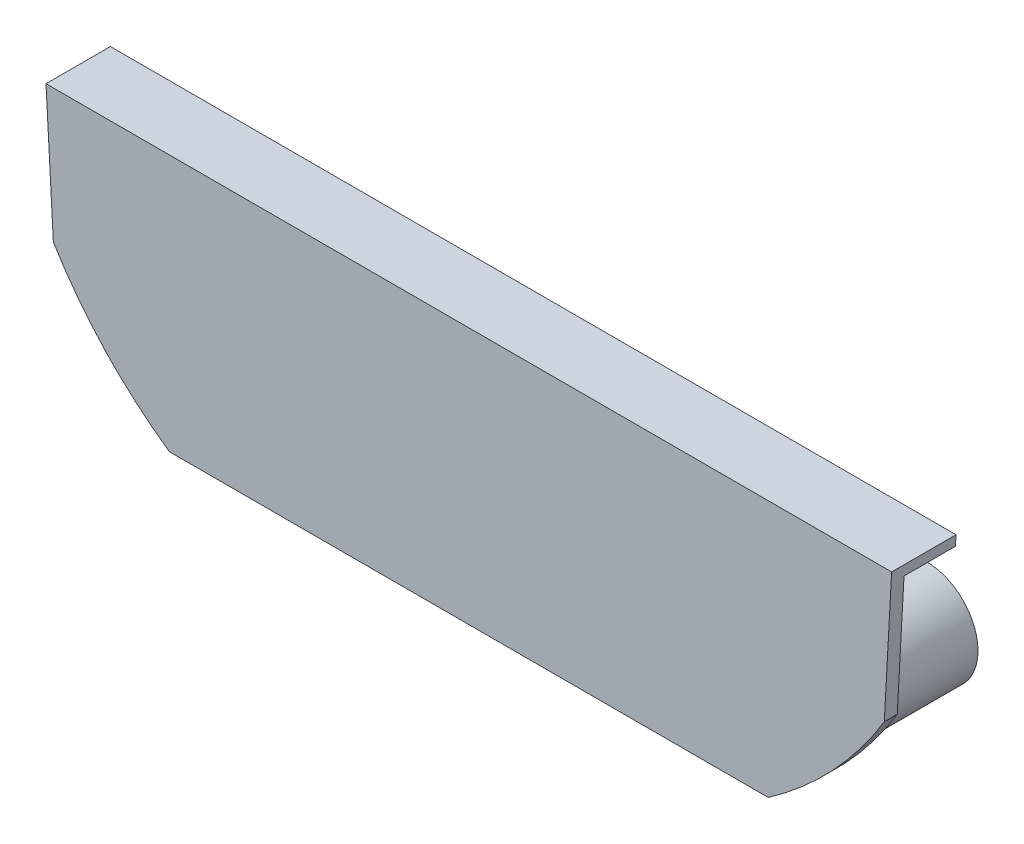
ISO-10303-21;
HEADER;
FILE_DESCRIPTION(('STEP AP214'),'2;1');
FILE_NAME('part.step','',(''),(''),'','','');
FILE_SCHEMA(('AUTOMOTIVE_DESIGN { 1 0 10303 214 1 1 1 1 }'));
ENDSEC;
DATA;
#1=APPLICATION_CONTEXT('core data for automotive mechanical design processes');
#2=APPLICATION_PROTOCOL_DEFINITION('international standard','automotive_design',2000,#1);
#3=PRODUCT_CONTEXT('',#1,'mechanical');
#4=PRODUCT('Part','Part','',(#3));
#5=PRODUCT_RELATED_PRODUCT_CATEGORY('part','',(#4));
#6=PRODUCT_DEFINITION_FORMATION('','',#4);
#7=PRODUCT_DEFINITION_CONTEXT('part definition',#1,'design');
#8=PRODUCT_DEFINITION('design','',#6,#7);
#9=PRODUCT_DEFINITION_SHAPE('','',#8);
#10=(LENGTH_UNIT() NAMED_UNIT(*) SI_UNIT(.MILLI.,.METRE.));
#11=(NAMED_UNIT(*) PLANE_ANGLE_UNIT() SI_UNIT($,.RADIAN.));
#12=(NAMED_UNIT(*) SI_UNIT($,.STERADIAN.) SOLID_ANGLE_UNIT());
#13=UNCERTAINTY_MEASURE_WITH_UNIT(LENGTH_MEASURE(1.E-05),#10,'distance_accuracy_value','');
#14=(GEOMETRIC_REPRESENTATION_CONTEXT(3) GLOBAL_UNCERTAINTY_ASSIGNED_CONTEXT((#13)) GLOBAL_UNIT_ASSIGNED_CONTEXT((#10,
#11,#12)) REPRESENTATION_CONTEXT('',''));
#15=CARTESIAN_POINT('',(0.,0.,0.));
#16=DIRECTION('',(0.,0.,1.));
#17=DIRECTION('',(1.,0.,0.));
#18=AXIS2_PLACEMENT_3D('',#15,#16,#17);
#19=CARTESIAN_POINT('',(22.8926152800397,32.8013439608821,0.));
#20=DIRECTION('',(0.,0.,1.));
#21=DIRECTION('',(1.,0.,0.));
#22=AXIS2_PLACEMENT_3D('',#19,#20,#21);
#23=PLANE('',#22);
#24=CARTESIAN_POINT('',(-3.61,11.3,0.));
#25=DIRECTION('',(0.,0.,1.));
#26=DIRECTION('',(1.,0.,0.));
#27=AXIS2_PLACEMENT_3D('',#24,#25,#26);
#28=CIRCLE('',#27,5.);
#29=CARTESIAN_POINT('',(1.39000000000001,11.3,0.));
#30=VERTEX_POINT('',#29);
#31=EDGE_CURVE('E131',#30,#30,#28,.T.);
#32=ORIENTED_EDGE('',*,*,#31,.T.);
#33=EDGE_LOOP('',(#32));
#34=FACE_BOUND('',#33,.T.);
#35=CARTESIAN_POINT('',(62.39,11.3,0.));
#36=DIRECTION('',(0.,0.,1.));
#37=DIRECTION('',(1.,0.,0.));
#38=AXIS2_PLACEMENT_3D('',#35,#36,#37);
#39=CIRCLE('',#38,4.99999999999999);
#40=CARTESIAN_POINT('',(67.39,11.3,0.));
#41=VERTEX_POINT('',#40);
#42=EDGE_CURVE('E38',#41,#41,#39,.T.);
#43=ORIENTED_EDGE('',*,*,#42,.T.);
#44=EDGE_LOOP('',(#43));
#45=FACE_BOUND('',#44,.T.);
#46=DIRECTION('',(-1.,0.,0.));
#47=VECTOR('',#46,1.);
#48=CARTESIAN_POINT('',(-11.9449307866786,24.,0.));
#49=LINE('',#48,#47);
#50=CARTESIAN_POINT('',(70.1949307866785,24.,0.));
#51=VERTEX_POINT('',#50);
#52=CARTESIAN_POINT('',(-11.9449307866786,24.,0.));
#53=VERTEX_POINT('',#52);
#54=EDGE_CURVE('E164',#51,#53,#49,.T.);
#55=ORIENTED_EDGE('',*,*,#54,.F.);
#56=DIRECTION('',(0.0549859008140824,0.99848713096948,0.));
#57=VECTOR('',#56,1.);
#58=CARTESIAN_POINT('',(70.25,25.,0.));
#59=LINE('',#58,#57);
#60=CARTESIAN_POINT('',(69.5351832894169,12.0196672973968,0.));
#61=VERTEX_POINT('',#60);
#62=EDGE_CURVE('E134',#61,#51,#59,.T.);
#63=ORIENTED_EDGE('',*,*,#62,.F.);
#64=CARTESIAN_POINT('',(35.3573847199603,32.8013439608821,0.));
#65=DIRECTION('',(0.,0.,1.));
#66=DIRECTION('',(-1.,0.,0.));
#67=AXIS2_PLACEMENT_3D('',#64,#65,#66);
#68=CIRCLE('',#67,40.);
#69=CARTESIAN_POINT('',(58.25,0.,0.));
#70=VERTEX_POINT('',#69);
#71=EDGE_CURVE('E71',#70,#61,#68,.T.);
#72=ORIENTED_EDGE('',*,*,#71,.F.);
#73=DIRECTION('',(1.,0.,0.));
#74=VECTOR('',#73,1.);
#75=CARTESIAN_POINT('',(0.,0.,0.));
#76=LINE('',#75,#74);
#77=CARTESIAN_POINT('',(0.,0.,0.));
#78=VERTEX_POINT('',#77);
#79=EDGE_CURVE('E130',#78,#70,#76,.T.);
#80=ORIENTED_EDGE('',*,*,#79,.F.);
#81=CARTESIAN_POINT('',(22.8926152800397,32.8013439608821,0.));
#82=DIRECTION('',(0.,0.,1.));
#83=DIRECTION('',(1.,0.,0.));
#84=AXIS2_PLACEMENT_3D('',#81,#82,#83);
#85=CIRCLE('',#84,40.);
#86=CARTESIAN_POINT('',(-11.2851832894169,12.0196672973968,0.));
#87=VERTEX_POINT('',#86);
#88=EDGE_CURVE('E127',#87,#78,#85,.T.);
#89=ORIENTED_EDGE('',*,*,#88,.F.);
#90=DIRECTION('',(0.0549859008140824,-0.99848713096948,0.));
#91=VECTOR('',#90,1.);
#92=CARTESIAN_POINT('',(-12.,25.,0.));
#93=LINE('',#92,#91);
#94=EDGE_CURVE('E78',#53,#87,#93,.T.);
#95=ORIENTED_EDGE('',*,*,#94,.F.);
#96=EDGE_LOOP('',(#55,#63,#72,#80,#89,#95));
#97=FACE_BOUND('',#96,.T.);
#98=ADVANCED_FACE('F34',(#34,#45,#97),#23,.F.);
#99=CARTESIAN_POINT('',(22.8926152800397,32.8013439608821,1.26));
#100=DIRECTION('',(0.,0.,-1.));
#101=DIRECTION('',(-1.,0.,0.));
#102=AXIS2_PLACEMENT_3D('',#99,#100,#101);
#103=CYLINDRICAL_SURFACE('',#102,40.);
#104=ORIENTED_EDGE('',*,*,#88,.T.);
#105=DIRECTION('',(0.,0.,-1.));
#106=VECTOR('',#105,1.);
#107=CARTESIAN_POINT('',(0.,0.,1.26));
#108=LINE('',#107,#106);
#109=CARTESIAN_POINT('',(0.,0.,1.26));
#110=VERTEX_POINT('',#109);
#111=EDGE_CURVE('E11',#110,#78,#108,.T.);
#112=ORIENTED_EDGE('',*,*,#111,.F.);
#113=CARTESIAN_POINT('',(22.8926152800397,32.8013439608821,1.26));
#114=DIRECTION('',(0.,0.,1.));
#115=DIRECTION('',(1.,0.,0.));
#116=AXIS2_PLACEMENT_3D('',#113,#114,#115);
#117=CIRCLE('',#116,40.);
#118=CARTESIAN_POINT('',(-11.2851832894169,12.0196672973968,1.26));
#119=VERTEX_POINT('',#118);
#120=EDGE_CURVE('E137',#119,#110,#117,.T.);
#121=ORIENTED_EDGE('',*,*,#120,.F.);
#122=DIRECTION('',(0.,0.,-1.));
#123=VECTOR('',#122,1.);
#124=CARTESIAN_POINT('',(-11.2851832894169,12.0196672973968,1.26));
#125=LINE('',#124,#123);
#126=EDGE_CURVE('E123',#119,#87,#125,.T.);
#127=ORIENTED_EDGE('',*,*,#126,.T.);
#128=EDGE_LOOP('',(#104,#112,#121,#127));
#129=FACE_BOUND('',#128,.T.);
#130=ADVANCED_FACE('F36',(#129),#103,.T.);
#131=CARTESIAN_POINT('',(0.,0.,1.26));
#132=DIRECTION('',(0.,1.,0.));
#133=DIRECTION('',(-1.,0.,0.));
#134=AXIS2_PLACEMENT_3D('',#131,#132,#133);
#135=PLANE('',#134);
#136=ORIENTED_EDGE('',*,*,#79,.T.);
#137=DIRECTION('',(0.,0.,-1.));
#138=VECTOR('',#137,1.);
#139=CARTESIAN_POINT('',(58.25,0.,1.26));
#140=LINE('',#139,#138);
#141=CARTESIAN_POINT('',(58.25,0.,1.26));
#142=VERTEX_POINT('',#141);
#143=EDGE_CURVE('E44',#142,#70,#140,.T.);
#144=ORIENTED_EDGE('',*,*,#143,.F.);
#145=DIRECTION('',(1.,0.,0.));
#146=VECTOR('',#145,1.);
#147=CARTESIAN_POINT('',(0.,0.,1.26));
#148=LINE('',#147,#146);
#149=EDGE_CURVE('E86',#110,#142,#148,.T.);
#150=ORIENTED_EDGE('',*,*,#149,.F.);
#151=ORIENTED_EDGE('',*,*,#111,.T.);
#152=EDGE_LOOP('',(#136,#144,#150,#151));
#153=FACE_BOUND('',#152,.T.);
#154=ADVANCED_FACE('F157',(#153),#135,.F.);
#155=CARTESIAN_POINT('',(35.3573847199603,32.8013439608821,1.26));
#156=DIRECTION('',(0.,0.,-1.));
#157=DIRECTION('',(-1.,0.,0.));
#158=AXIS2_PLACEMENT_3D('',#155,#156,#157);
#159=CYLINDRICAL_SURFACE('',#158,40.);
#160=ORIENTED_EDGE('',*,*,#71,.T.);
#161=DIRECTION('',(0.,0.,-1.));
#162=VECTOR('',#161,1.);
#163=CARTESIAN_POINT('',(69.5351832894169,12.0196672973968,1.26));
#164=LINE('',#163,#162);
#165=CARTESIAN_POINT('',(69.5351832894169,12.0196672973968,1.26));
#166=VERTEX_POINT('',#165);
#167=EDGE_CURVE('E117',#166,#61,#164,.T.);
#168=ORIENTED_EDGE('',*,*,#167,.F.);
#169=CARTESIAN_POINT('',(35.3573847199603,32.8013439608821,1.26));
#170=DIRECTION('',(0.,0.,1.));
#171=DIRECTION('',(-1.,0.,0.));
#172=AXIS2_PLACEMENT_3D('',#169,#170,#171);
#173=CIRCLE('',#172,40.);
#174=EDGE_CURVE('E103',#142,#166,#173,.T.);
#175=ORIENTED_EDGE('',*,*,#174,.F.);
#176=ORIENTED_EDGE('',*,*,#143,.T.);
#177=EDGE_LOOP('',(#160,#168,#175,#176));
#178=FACE_BOUND('',#177,.T.);
#179=ADVANCED_FACE('F158',(#178),#159,.T.);
#180=CARTESIAN_POINT('',(70.25,25.,1.26));
#181=DIRECTION('',(-0.99848713096948,0.0549859008140824,0.));
#182=DIRECTION('',(-0.0549859008140824,-0.99848713096948,0.));
#183=AXIS2_PLACEMENT_3D('',#180,#181,#182);
#184=PLANE('',#183);
#185=ORIENTED_EDGE('',*,*,#62,.T.);
#186=DIRECTION('',(0.,0.,1.));
#187=VECTOR('',#186,1.);
#188=CARTESIAN_POINT('',(70.1949307866785,24.,-5.));
#189=LINE('',#188,#187);
#190=CARTESIAN_POINT('',(70.1949307866785,24.,-5.));
#191=VERTEX_POINT('',#190);
#192=EDGE_CURVE('E177',#191,#51,#189,.T.);
#193=ORIENTED_EDGE('',*,*,#192,.F.);
#194=DIRECTION('',(-0.0549859008140927,-0.99848713096948,0.));
#195=VECTOR('',#194,1.);
#196=CARTESIAN_POINT('',(70.1949307866785,24.,-5.));
#197=LINE('',#196,#195);
#198=CARTESIAN_POINT('',(70.25,25.,-5.));
#199=VERTEX_POINT('',#198);
#200=EDGE_CURVE('E113',#199,#191,#197,.T.);
#201=ORIENTED_EDGE('',*,*,#200,.F.);
#202=DIRECTION('',(0.,0.,-1.));
#203=VECTOR('',#202,1.);
#204=CARTESIAN_POINT('',(70.25,25.,1.26));
#205=LINE('',#204,#203);
#206=CARTESIAN_POINT('',(70.25,25.,1.26));
#207=VERTEX_POINT('',#206);
#208=EDGE_CURVE('E108',#207,#199,#205,.T.);
#209=ORIENTED_EDGE('',*,*,#208,.F.);
#210=DIRECTION('',(0.0549859008140824,0.99848713096948,0.));
#211=VECTOR('',#210,1.);
#212=CARTESIAN_POINT('',(70.25,25.,1.26));
#213=LINE('',#212,#211);
#214=EDGE_CURVE('E96',#166,#207,#213,.T.);
#215=ORIENTED_EDGE('',*,*,#214,.F.);
#216=ORIENTED_EDGE('',*,*,#167,.T.);
#217=EDGE_LOOP('',(#185,#193,#201,#209,#215,#216));
#218=FACE_BOUND('',#217,.T.);
#219=ADVANCED_FACE('F110',(#218),#184,.F.);
#220=CARTESIAN_POINT('',(-12.,25.,1.26));
#221=DIRECTION('',(0.,-1.,0.));
#222=DIRECTION('',(1.,0.,0.));
#223=AXIS2_PLACEMENT_3D('',#220,#221,#222);
#224=PLANE('',#223);
#225=ORIENTED_EDGE('',*,*,#208,.T.);
#226=DIRECTION('',(1.,0.,0.));
#227=VECTOR('',#226,1.);
#228=CARTESIAN_POINT('',(70.25,25.,-5.));
#229=LINE('',#228,#227);
#230=CARTESIAN_POINT('',(-12.,25.,-5.));
#231=VERTEX_POINT('',#230);
#232=EDGE_CURVE('E174',#231,#199,#229,.T.);
#233=ORIENTED_EDGE('',*,*,#232,.F.);
#234=DIRECTION('',(0.,0.,-1.));
#235=VECTOR('',#234,1.);
#236=CARTESIAN_POINT('',(-12.,25.,1.26));
#237=LINE('',#236,#235);
#238=CARTESIAN_POINT('',(-12.,25.,1.26));
#239=VERTEX_POINT('',#238);
#240=EDGE_CURVE('E118',#239,#231,#237,.T.);
#241=ORIENTED_EDGE('',*,*,#240,.F.);
#242=DIRECTION('',(-1.,0.,0.));
#243=VECTOR('',#242,1.);
#244=CARTESIAN_POINT('',(-12.,25.,1.26));
#245=LINE('',#244,#243);
#246=EDGE_CURVE('E100',#207,#239,#245,.T.);
#247=ORIENTED_EDGE('',*,*,#246,.F.);
#248=EDGE_LOOP('',(#225,#233,#241,#247));
#249=FACE_BOUND('',#248,.T.);
#250=ADVANCED_FACE('F120',(#249),#224,.F.);
#251=CARTESIAN_POINT('',(-12.,25.,1.26));
#252=DIRECTION('',(0.99848713096948,0.0549859008140824,0.));
#253=DIRECTION('',(-0.0549859008140824,0.99848713096948,0.));
#254=AXIS2_PLACEMENT_3D('',#251,#252,#253);
#255=PLANE('',#254);
#256=ORIENTED_EDGE('',*,*,#240,.T.);
#257=DIRECTION('',(-0.0549859008140818,0.99848713096948,0.));
#258=VECTOR('',#257,1.);
#259=CARTESIAN_POINT('',(-12.,25.,-5.));
#260=LINE('',#259,#258);
#261=CARTESIAN_POINT('',(-11.9449307866786,24.,-5.));
#262=VERTEX_POINT('',#261);
#263=EDGE_CURVE('E310',#262,#231,#260,.T.);
#264=ORIENTED_EDGE('',*,*,#263,.F.);
#265=DIRECTION('',(0.,0.,1.));
#266=VECTOR('',#265,1.);
#267=CARTESIAN_POINT('',(-11.9449307866786,24.,-5.));
#268=LINE('',#267,#266);
#269=EDGE_CURVE('E176',#262,#53,#268,.T.);
#270=ORIENTED_EDGE('',*,*,#269,.T.);
#271=ORIENTED_EDGE('',*,*,#94,.T.);
#272=ORIENTED_EDGE('',*,*,#126,.F.);
#273=DIRECTION('',(0.0549859008140824,-0.99848713096948,0.));
#274=VECTOR('',#273,1.);
#275=CARTESIAN_POINT('',(-12.,25.,1.26));
#276=LINE('',#275,#274);
#277=EDGE_CURVE('E53',#239,#119,#276,.T.);
#278=ORIENTED_EDGE('',*,*,#277,.F.);
#279=EDGE_LOOP('',(#256,#264,#270,#271,#272,#278));
#280=FACE_BOUND('',#279,.T.);
#281=ADVANCED_FACE('F207',(#280),#255,.F.);
#282=CARTESIAN_POINT('',(22.8926152800397,32.8013439608821,1.26));
#283=DIRECTION('',(0.,0.,1.));
#284=DIRECTION('',(1.,0.,0.));
#285=AXIS2_PLACEMENT_3D('',#282,#283,#284);
#286=PLANE('',#285);
#287=ORIENTED_EDGE('',*,*,#120,.T.);
#288=ORIENTED_EDGE('',*,*,#149,.T.);
#289=ORIENTED_EDGE('',*,*,#174,.T.);
#290=ORIENTED_EDGE('',*,*,#214,.T.);
#291=ORIENTED_EDGE('',*,*,#246,.T.);
#292=ORIENTED_EDGE('',*,*,#277,.T.);
#293=EDGE_LOOP('',(#287,#288,#289,#290,#291,#292));
#294=FACE_BOUND('',#293,.T.);
#295=ADVANCED_FACE('F98',(#294),#286,.T.);
#296=CARTESIAN_POINT('',(-3.61,11.3,-10.));
#297=DIRECTION('',(0.,0.,1.));
#298=DIRECTION('',(1.,0.,0.));
#299=AXIS2_PLACEMENT_3D('',#296,#297,#298);
#300=CYLINDRICAL_SURFACE('',#299,5.);
#301=CARTESIAN_POINT('',(-3.61,11.3,-10.));
#302=DIRECTION('',(0.,0.,1.));
#303=DIRECTION('',(1.,0.,0.));
#304=AXIS2_PLACEMENT_3D('',#301,#302,#303);
#305=CIRCLE('',#304,5.);
#306=CARTESIAN_POINT('',(1.39000000000001,11.3,-10.));
#307=VERTEX_POINT('',#306);
#308=EDGE_CURVE('E142',#307,#307,#305,.T.);
#309=ORIENTED_EDGE('',*,*,#308,.T.);
#310=EDGE_LOOP('',(#309));
#311=FACE_BOUND('',#310,.T.);
#312=ORIENTED_EDGE('',*,*,#31,.F.);
#313=EDGE_LOOP('',(#312));
#314=FACE_BOUND('',#313,.T.);
#315=ADVANCED_FACE('F243',(#311,#314),#300,.T.);
#316=CARTESIAN_POINT('',(0.,0.,-10.));
#317=DIRECTION('',(0.,0.,1.));
#318=DIRECTION('',(1.,0.,0.));
#319=AXIS2_PLACEMENT_3D('',#316,#317,#318);
#320=PLANE('',#319);
#321=ORIENTED_EDGE('',*,*,#308,.F.);
#322=EDGE_LOOP('',(#321));
#323=FACE_BOUND('',#322,.T.);
#324=ADVANCED_FACE('F195',(#323),#320,.F.);
#325=CARTESIAN_POINT('',(62.39,11.3,-10.));
#326=DIRECTION('',(0.,0.,1.));
#327=DIRECTION('',(1.,0.,0.));
#328=AXIS2_PLACEMENT_3D('',#325,#326,#327);
#329=CYLINDRICAL_SURFACE('',#328,4.99999999999999);
#330=CARTESIAN_POINT('',(62.39,11.3,-10.));
#331=DIRECTION('',(0.,0.,1.));
#332=DIRECTION('',(1.,0.,0.));
#333=AXIS2_PLACEMENT_3D('',#330,#331,#332);
#334=CIRCLE('',#333,4.99999999999999);
#335=CARTESIAN_POINT('',(67.39,11.3,-10.));
#336=VERTEX_POINT('',#335);
#337=EDGE_CURVE('E150',#336,#336,#334,.T.);
#338=ORIENTED_EDGE('',*,*,#337,.T.);
#339=EDGE_LOOP('',(#338));
#340=FACE_BOUND('',#339,.T.);
#341=ORIENTED_EDGE('',*,*,#42,.F.);
#342=EDGE_LOOP('',(#341));
#343=FACE_BOUND('',#342,.T.);
#344=ADVANCED_FACE('F182',(#340,#343),#329,.T.);
#345=CARTESIAN_POINT('',(0.,0.,-10.));
#346=DIRECTION('',(0.,0.,1.));
#347=DIRECTION('',(1.,0.,0.));
#348=AXIS2_PLACEMENT_3D('',#345,#346,#347);
#349=PLANE('',#348);
#350=ORIENTED_EDGE('',*,*,#337,.F.);
#351=EDGE_LOOP('',(#350));
#352=FACE_BOUND('',#351,.T.);
#353=ADVANCED_FACE('F185',(#352),#349,.F.);
#354=CARTESIAN_POINT('',(-11.9449307866786,24.,-5.));
#355=DIRECTION('',(0.,1.,0.));
#356=DIRECTION('',(-1.,0.,0.));
#357=AXIS2_PLACEMENT_3D('',#354,#355,#356);
#358=PLANE('',#357);
#359=ORIENTED_EDGE('',*,*,#54,.T.);
#360=ORIENTED_EDGE('',*,*,#269,.F.);
#361=DIRECTION('',(-1.,0.,0.));
#362=VECTOR('',#361,1.);
#363=CARTESIAN_POINT('',(-11.9449307866786,24.,-5.));
#364=LINE('',#363,#362);
#365=EDGE_CURVE('E170',#191,#262,#364,.T.);
#366=ORIENTED_EDGE('',*,*,#365,.F.);
#367=ORIENTED_EDGE('',*,*,#192,.T.);
#368=EDGE_LOOP('',(#359,#360,#366,#367));
#369=FACE_BOUND('',#368,.T.);
#370=ADVANCED_FACE('F187',(#369),#358,.F.);
#371=CARTESIAN_POINT('',(0.,0.,-5.));
#372=DIRECTION('',(0.,0.,1.));
#373=DIRECTION('',(1.,0.,0.));
#374=AXIS2_PLACEMENT_3D('',#371,#372,#373);
#375=PLANE('',#374);
#376=ORIENTED_EDGE('',*,*,#200,.T.);
#377=ORIENTED_EDGE('',*,*,#365,.T.);
#378=ORIENTED_EDGE('',*,*,#263,.T.);
#379=ORIENTED_EDGE('',*,*,#232,.T.);
#380=EDGE_LOOP('',(#376,#377,#378,#379));
#381=FACE_BOUND('',#380,.T.);
#382=ADVANCED_FACE('F193',(#381),#375,.F.);
#383=CLOSED_SHELL('',(#98,#130,#154,#179,#219,#250,#281,#295,#315,#324,#344,#353,#370,#382));
#384=MANIFOLD_SOLID_BREP('B2',#383);
#385=ADVANCED_BREP_SHAPE_REPRESENTATION('',(#18,#384),#14);
#386=SHAPE_DEFINITION_REPRESENTATION(#9,#385);
ENDSEC;
END-ISO-10303-21;
